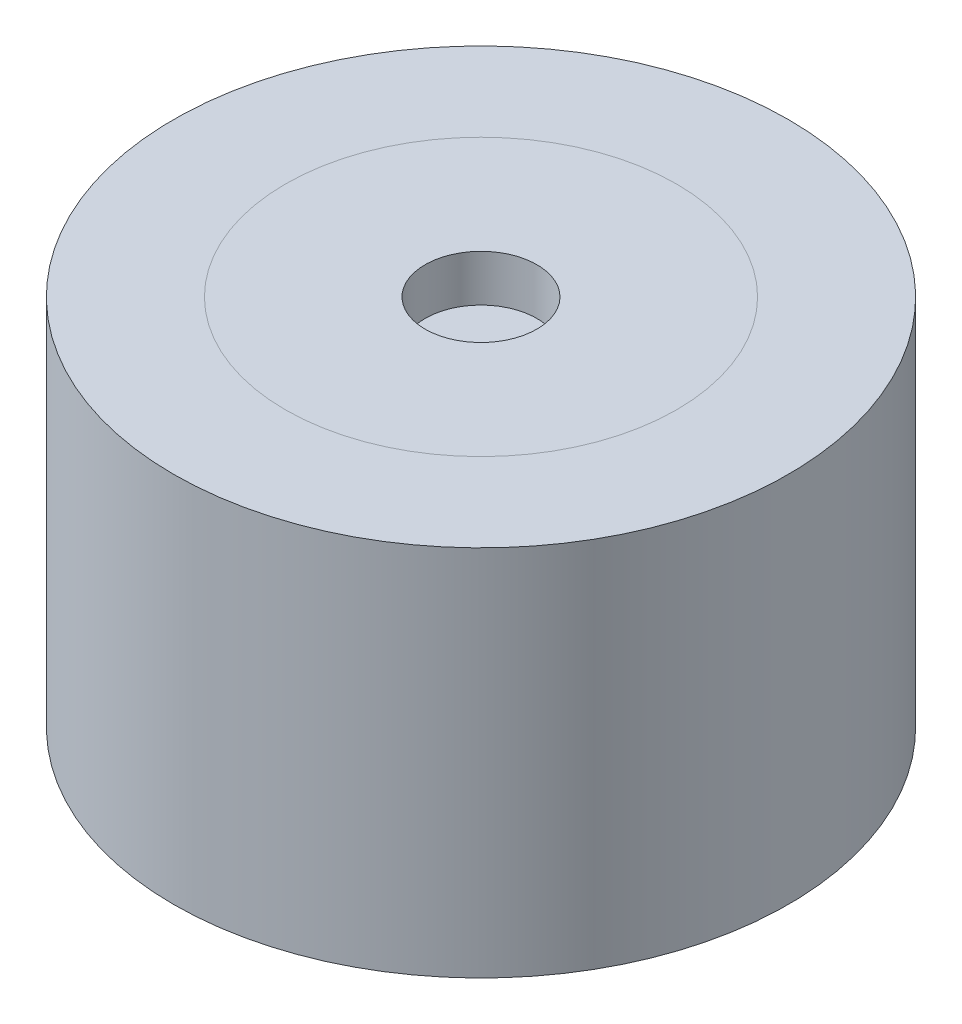
ISO-10303-21;
HEADER;
FILE_DESCRIPTION(('STEP AP214'),'2;1');
FILE_NAME('part.step','',(''),(''),'','','');
FILE_SCHEMA(('AUTOMOTIVE_DESIGN { 1 0 10303 214 1 1 1 1 }'));
ENDSEC;
DATA;
#1=APPLICATION_CONTEXT('core data for automotive mechanical design processes');
#2=APPLICATION_PROTOCOL_DEFINITION('international standard','automotive_design',2000,#1);
#3=PRODUCT_CONTEXT('',#1,'mechanical');
#4=PRODUCT('Part','Part','',(#3));
#5=PRODUCT_RELATED_PRODUCT_CATEGORY('part','',(#4));
#6=PRODUCT_DEFINITION_FORMATION('','',#4);
#7=PRODUCT_DEFINITION_CONTEXT('part definition',#1,'design');
#8=PRODUCT_DEFINITION('design','',#6,#7);
#9=PRODUCT_DEFINITION_SHAPE('','',#8);
#10=(LENGTH_UNIT() NAMED_UNIT(*) SI_UNIT(.MILLI.,.METRE.));
#11=(NAMED_UNIT(*) PLANE_ANGLE_UNIT() SI_UNIT($,.RADIAN.));
#12=(NAMED_UNIT(*) SI_UNIT($,.STERADIAN.) SOLID_ANGLE_UNIT());
#13=UNCERTAINTY_MEASURE_WITH_UNIT(LENGTH_MEASURE(1.E-05),#10,'distance_accuracy_value','');
#14=(GEOMETRIC_REPRESENTATION_CONTEXT(3) GLOBAL_UNCERTAINTY_ASSIGNED_CONTEXT((#13)) GLOBAL_UNIT_ASSIGNED_CONTEXT((#10,
#11,#12)) REPRESENTATION_CONTEXT('',''));
#15=CARTESIAN_POINT('',(0.,0.,0.));
#16=DIRECTION('',(0.,0.,1.));
#17=DIRECTION('',(1.,0.,0.));
#18=AXIS2_PLACEMENT_3D('',#15,#16,#17);
#19=CARTESIAN_POINT('',(0.,40.01,0.));
#20=DIRECTION('',(0.,-1.,0.));
#21=DIRECTION('',(0.,0.,-1.));
#22=AXIS2_PLACEMENT_3D('',#19,#20,#21);
#23=CYLINDRICAL_SURFACE('',#22,21.);
#24=CARTESIAN_POINT('',(0.,0.,0.));
#25=DIRECTION('',(0.,1.,0.));
#26=DIRECTION('',(0.,0.,1.));
#27=AXIS2_PLACEMENT_3D('',#24,#25,#26);
#28=CIRCLE('',#27,21.);
#29=CARTESIAN_POINT('',(0.,0.,21.));
#30=VERTEX_POINT('',#29);
#31=EDGE_CURVE('E44',#30,#30,#28,.T.);
#32=ORIENTED_EDGE('',*,*,#31,.T.);
#33=EDGE_LOOP('',(#32));
#34=FACE_BOUND('',#33,.T.);
#35=CARTESIAN_POINT('',(0.,40.,0.));
#36=DIRECTION('',(0.,1.,0.));
#37=DIRECTION('',(0.,0.,1.));
#38=AXIS2_PLACEMENT_3D('',#35,#36,#37);
#39=CIRCLE('',#38,21.);
#40=CARTESIAN_POINT('',(0.,40.,21.));
#41=VERTEX_POINT('',#40);
#42=EDGE_CURVE('E53',#41,#41,#39,.T.);
#43=ORIENTED_EDGE('',*,*,#42,.F.);
#44=EDGE_LOOP('',(#43));
#45=FACE_BOUND('',#44,.T.);
#46=ADVANCED_FACE('F40',(#34,#45),#23,.T.);
#47=CARTESIAN_POINT('',(0.,0.,0.));
#48=DIRECTION('',(0.,1.,0.));
#49=DIRECTION('',(0.,0.,1.));
#50=AXIS2_PLACEMENT_3D('',#47,#48,#49);
#51=PLANE('',#50);
#52=ORIENTED_EDGE('',*,*,#31,.F.);
#53=EDGE_LOOP('',(#52));
#54=FACE_BOUND('',#53,.T.);
#55=ADVANCED_FACE('F63',(#54),#51,.F.);
#56=CARTESIAN_POINT('',(0.,40.,0.));
#57=DIRECTION('',(0.,1.,0.));
#58=DIRECTION('',(0.,0.,1.));
#59=AXIS2_PLACEMENT_3D('',#56,#57,#58);
#60=PLANE('',#59);
#61=CARTESIAN_POINT('',(0.,40.,0.));
#62=DIRECTION('',(0.,1.,0.));
#63=DIRECTION('',(0.,0.,1.));
#64=AXIS2_PLACEMENT_3D('',#61,#62,#63);
#65=CIRCLE('',#64,6.);
#66=CARTESIAN_POINT('',(0.,40.,6.));
#67=VERTEX_POINT('',#66);
#68=EDGE_CURVE('E11',#67,#67,#65,.T.);
#69=ORIENTED_EDGE('',*,*,#68,.F.);
#70=EDGE_LOOP('',(#69));
#71=FACE_BOUND('',#70,.T.);
#72=ORIENTED_EDGE('',*,*,#42,.T.);
#73=EDGE_LOOP('',(#72));
#74=FACE_BOUND('',#73,.T.);
#75=ADVANCED_FACE('F42',(#71,#74),#60,.T.);
#76=CARTESIAN_POINT('',(0.,35.,0.));
#77=DIRECTION('',(0.,1.,0.));
#78=DIRECTION('',(0.,0.,1.));
#79=AXIS2_PLACEMENT_3D('',#76,#77,#78);
#80=CYLINDRICAL_SURFACE('',#79,6.);
#81=CARTESIAN_POINT('',(0.,35.,0.));
#82=DIRECTION('',(0.,1.,0.));
#83=DIRECTION('',(0.,0.,1.));
#84=AXIS2_PLACEMENT_3D('',#81,#82,#83);
#85=CIRCLE('',#84,6.);
#86=CARTESIAN_POINT('',(0.,35.,6.));
#87=VERTEX_POINT('',#86);
#88=EDGE_CURVE('E48',#87,#87,#85,.T.);
#89=ORIENTED_EDGE('',*,*,#88,.F.);
#90=EDGE_LOOP('',(#89));
#91=FACE_BOUND('',#90,.T.);
#92=ORIENTED_EDGE('',*,*,#68,.T.);
#93=EDGE_LOOP('',(#92));
#94=FACE_BOUND('',#93,.T.);
#95=ADVANCED_FACE('F69',(#91,#94),#80,.F.);
#96=CARTESIAN_POINT('',(0.,35.,0.));
#97=DIRECTION('',(0.,1.,0.));
#98=DIRECTION('',(0.,0.,1.));
#99=AXIS2_PLACEMENT_3D('',#96,#97,#98);
#100=PLANE('',#99);
#101=ORIENTED_EDGE('',*,*,#88,.T.);
#102=EDGE_LOOP('',(#101));
#103=FACE_BOUND('',#102,.T.);
#104=ADVANCED_FACE('F72',(#103),#100,.T.);
#105=CLOSED_SHELL('',(#46,#55,#75,#95,#104));
#106=MANIFOLD_SOLID_BREP('B2',#105);
#107=CARTESIAN_POINT('',(0.,40.01,0.));
#108=DIRECTION('',(0.,-1.,0.));
#109=DIRECTION('',(0.,0.,-1.));
#110=AXIS2_PLACEMENT_3D('',#107,#108,#109);
#111=CYLINDRICAL_SURFACE('',#110,21.);
#112=CARTESIAN_POINT('',(0.,40.,0.));
#113=DIRECTION('',(0.,1.,0.));
#114=DIRECTION('',(0.,0.,1.));
#115=AXIS2_PLACEMENT_3D('',#112,#113,#114);
#116=CIRCLE('',#115,21.);
#117=CARTESIAN_POINT('',(0.,40.,21.));
#118=VERTEX_POINT('',#117);
#119=EDGE_CURVE('E39',#118,#118,#116,.T.);
#120=ORIENTED_EDGE('',*,*,#119,.T.);
#121=EDGE_LOOP('',(#120));
#122=FACE_BOUND('',#121,.T.);
#123=CARTESIAN_POINT('',(0.,0.,0.));
#124=DIRECTION('',(0.,1.,0.));
#125=DIRECTION('',(0.,0.,1.));
#126=AXIS2_PLACEMENT_3D('',#123,#124,#125);
#127=CIRCLE('',#126,21.);
#128=CARTESIAN_POINT('',(0.,0.,21.));
#129=VERTEX_POINT('',#128);
#130=EDGE_CURVE('E116',#129,#129,#127,.T.);
#131=ORIENTED_EDGE('',*,*,#130,.F.);
#132=EDGE_LOOP('',(#131));
#133=FACE_BOUND('',#132,.T.);
#134=ADVANCED_FACE('F110',(#122,#133),#111,.F.);
#135=CARTESIAN_POINT('',(0.,40.,0.));
#136=DIRECTION('',(0.,-1.,0.));
#137=DIRECTION('',(0.,0.,-1.));
#138=AXIS2_PLACEMENT_3D('',#135,#136,#137);
#139=CYLINDRICAL_SURFACE('',#138,33.);
#140=CARTESIAN_POINT('',(0.,40.,0.));
#141=DIRECTION('',(0.,1.,0.));
#142=DIRECTION('',(0.,0.,1.));
#143=AXIS2_PLACEMENT_3D('',#140,#141,#142);
#144=CIRCLE('',#143,33.);
#145=CARTESIAN_POINT('',(0.,40.,33.));
#146=VERTEX_POINT('',#145);
#147=EDGE_CURVE('E120',#146,#146,#144,.T.);
#148=ORIENTED_EDGE('',*,*,#147,.F.);
#149=EDGE_LOOP('',(#148));
#150=FACE_BOUND('',#149,.T.);
#151=CARTESIAN_POINT('',(0.,0.,0.));
#152=DIRECTION('',(0.,1.,0.));
#153=DIRECTION('',(0.,0.,1.));
#154=AXIS2_PLACEMENT_3D('',#151,#152,#153);
#155=CIRCLE('',#154,33.);
#156=CARTESIAN_POINT('',(0.,0.,33.));
#157=VERTEX_POINT('',#156);
#158=EDGE_CURVE('E124',#157,#157,#155,.T.);
#159=ORIENTED_EDGE('',*,*,#158,.T.);
#160=EDGE_LOOP('',(#159));
#161=FACE_BOUND('',#160,.T.);
#162=ADVANCED_FACE('F130',(#150,#161),#139,.T.);
#163=CARTESIAN_POINT('',(0.,0.,0.));
#164=DIRECTION('',(0.,1.,0.));
#165=DIRECTION('',(0.,0.,1.));
#166=AXIS2_PLACEMENT_3D('',#163,#164,#165);
#167=PLANE('',#166);
#168=ORIENTED_EDGE('',*,*,#130,.T.);
#169=EDGE_LOOP('',(#168));
#170=FACE_BOUND('',#169,.T.);
#171=ORIENTED_EDGE('',*,*,#158,.F.);
#172=EDGE_LOOP('',(#171));
#173=FACE_BOUND('',#172,.T.);
#174=ADVANCED_FACE('F132',(#170,#173),#167,.F.);
#175=CARTESIAN_POINT('',(0.,40.,0.));
#176=DIRECTION('',(0.,1.,0.));
#177=DIRECTION('',(0.,0.,1.));
#178=AXIS2_PLACEMENT_3D('',#175,#176,#177);
#179=PLANE('',#178);
#180=ORIENTED_EDGE('',*,*,#119,.F.);
#181=EDGE_LOOP('',(#180));
#182=FACE_BOUND('',#181,.T.);
#183=ORIENTED_EDGE('',*,*,#147,.T.);
#184=EDGE_LOOP('',(#183));
#185=FACE_BOUND('',#184,.T.);
#186=ADVANCED_FACE('F134',(#182,#185),#179,.T.);
#187=CLOSED_SHELL('',(#134,#162,#174,#186));
#188=MANIFOLD_SOLID_BREP('B6',#187);
#189=ADVANCED_BREP_SHAPE_REPRESENTATION('',(#18,#106,#188),#14);
#190=SHAPE_DEFINITION_REPRESENTATION(#9,#189);
ENDSEC;
END-ISO-10303-21;
